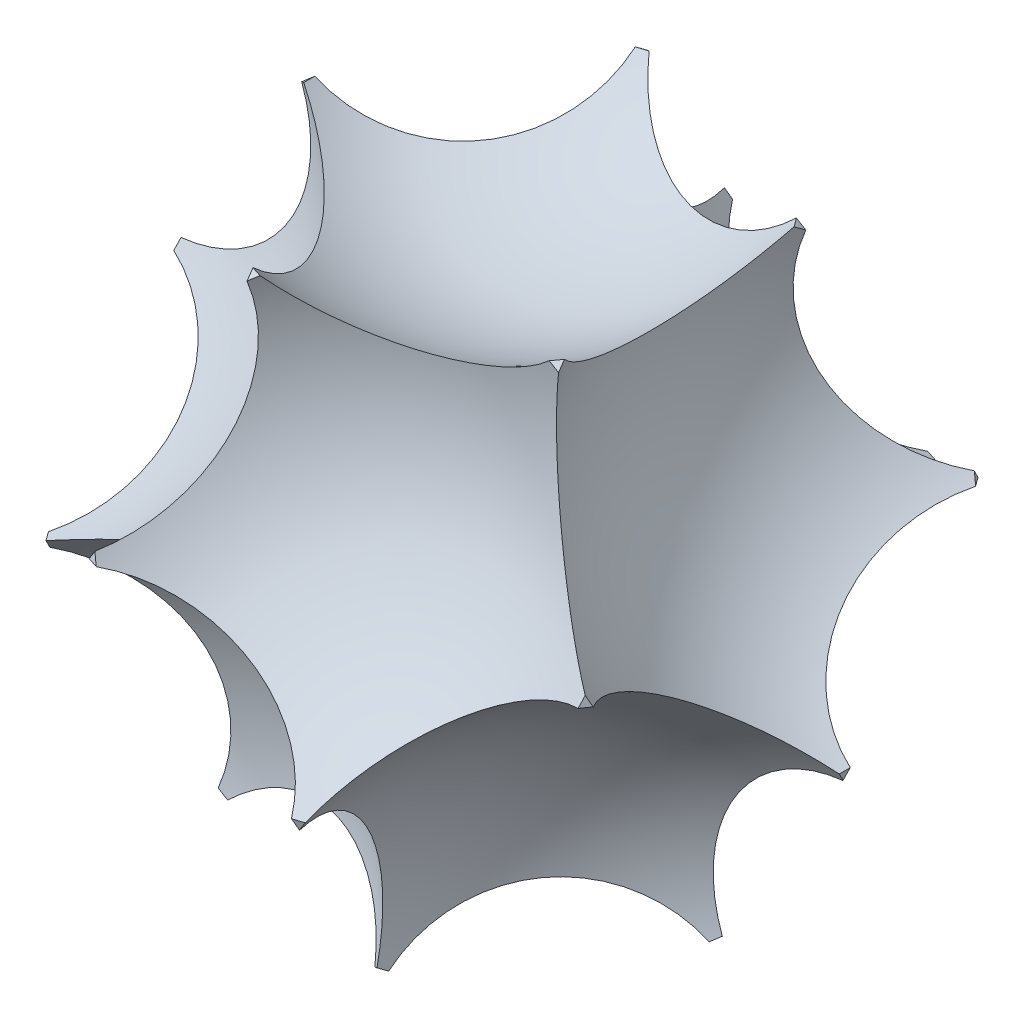
ISO-10303-21;
HEADER;
FILE_DESCRIPTION(('STEP AP214'),'2;1');
FILE_NAME('part.step','',(''),(''),'','','');
FILE_SCHEMA(('AUTOMOTIVE_DESIGN { 1 0 10303 214 1 1 1 1 }'));
ENDSEC;
DATA;
#1=APPLICATION_CONTEXT('core data for automotive mechanical design processes');
#2=APPLICATION_PROTOCOL_DEFINITION('international standard','automotive_design',2000,#1);
#3=PRODUCT_CONTEXT('',#1,'mechanical');
#4=PRODUCT('Part','Part','',(#3));
#5=PRODUCT_RELATED_PRODUCT_CATEGORY('part','',(#4));
#6=PRODUCT_DEFINITION_FORMATION('','',#4);
#7=PRODUCT_DEFINITION_CONTEXT('part definition',#1,'design');
#8=PRODUCT_DEFINITION('design','',#6,#7);
#9=PRODUCT_DEFINITION_SHAPE('','',#8);
#10=(LENGTH_UNIT() NAMED_UNIT(*) SI_UNIT(.MILLI.,.METRE.));
#11=(NAMED_UNIT(*) PLANE_ANGLE_UNIT() SI_UNIT($,.RADIAN.));
#12=(NAMED_UNIT(*) SI_UNIT($,.STERADIAN.) SOLID_ANGLE_UNIT());
#13=UNCERTAINTY_MEASURE_WITH_UNIT(LENGTH_MEASURE(1.E-05),#10,'distance_accuracy_value','');
#14=(GEOMETRIC_REPRESENTATION_CONTEXT(3) GLOBAL_UNCERTAINTY_ASSIGNED_CONTEXT((#13)) GLOBAL_UNIT_ASSIGNED_CONTEXT((#10,
#11,#12)) REPRESENTATION_CONTEXT('',''));
#15=CARTESIAN_POINT('',(0.,0.,0.));
#16=DIRECTION('',(0.,0.,1.));
#17=DIRECTION('',(1.,0.,0.));
#18=AXIS2_PLACEMENT_3D('',#15,#16,#17);
#19=CARTESIAN_POINT('',(0.,0.,0.));
#20=DIRECTION('',(0.,0.,1.));
#21=DIRECTION('',(-1.,0.,0.));
#22=AXIS2_PLACEMENT_3D('',#19,#20,#21);
#23=SPHERICAL_SURFACE('',#22,62.5);
#24=CARTESIAN_POINT('',(13.8234335866723,22.366785384462,-42.544153976935));
#25=DIRECTION('',(0.27639320225003,0.447213595499962,-0.850650808352035));
#26=DIRECTION('',(0.,0.885131422637845,0.465341127194992));
#27=AXIS2_PLACEMENT_3D('',#24,#25,#26);
#28=CIRCLE('',#27,37.4817896828196);
#29=CARTESIAN_POINT('',(29.7143347656824,50.0136525578055,-22.8460689673317));
#30=VERTEX_POINT('',#29);
#31=CARTESIAN_POINT('',(31.4449162804732,48.9440943613624,-22.8460689673317));
#32=VERTEX_POINT('',#31);
#33=EDGE_CURVE('E302',#30,#32,#28,.T.);
#34=ORIENTED_EDGE('',*,*,#33,.F.);
#35=CARTESIAN_POINT('',(0.,50.0136525578055,0.));
#36=DIRECTION('',(0.,1.,0.));
#37=DIRECTION('',(-1.,0.,0.));
#38=AXIS2_PLACEMENT_3D('',#35,#36,#37);
#39=CIRCLE('',#38,37.4817896828196);
#40=CARTESIAN_POINT('',(30.9101371822517,50.0136525578055,-21.2001881407099));
#41=VERTEX_POINT('',#40);
#42=EDGE_CURVE('E378',#41,#30,#39,.T.);
#43=ORIENTED_EDGE('',*,*,#42,.F.);
#44=CARTESIAN_POINT('',(44.7335707689236,22.366785384462,0.));
#45=DIRECTION('',(0.894427190999914,0.447213595499962,0.));
#46=DIRECTION('',(-0.447213595499962,0.894427190999914,0.));
#47=AXIS2_PLACEMENT_3D('',#44,#45,#46);
#48=CIRCLE('',#47,37.4817896828196);
#49=EDGE_CURVE('E357',#32,#41,#48,.T.);
#50=ORIENTED_EDGE('',*,*,#49,.F.);
#51=EDGE_LOOP('',(#34,#43,#50));
#52=FACE_BOUND('',#51,.T.);
#53=ADVANCED_FACE('F41',(#52),#23,.T.);
#54=CARTESIAN_POINT('',(49.478873459584,12.8761800031414,-35.9485058061831));
#55=VERTEX_POINT('',#54);
#56=CARTESIAN_POINT('',(49.1483618004099,11.1455984883499,-36.9657160984675));
#57=VERTEX_POINT('',#56);
#58=EDGE_CURVE('E250',#55,#57,#28,.T.);
#59=ORIENTED_EDGE('',*,*,#58,.F.);
#60=CARTESIAN_POINT('',(50.3441642169797,11.1455984883499,-35.3198352718451));
#61=VERTEX_POINT('',#60);
#62=EDGE_CURVE('E363',#61,#55,#48,.T.);
#63=ORIENTED_EDGE('',*,*,#62,.F.);
#64=CARTESIAN_POINT('',(36.1902189711337,-22.366785384462,-26.2937331803548));
#65=DIRECTION('',(0.72360679774998,-0.447213595499962,-0.525731112119128));
#66=DIRECTION('',(-0.587785252292469,0.,-0.809016994374951));
#67=AXIS2_PLACEMENT_3D('',#64,#65,#66);
#68=CIRCLE('',#67,37.4817896828196);
#69=EDGE_CURVE('E473',#57,#61,#68,.T.);
#70=ORIENTED_EDGE('',*,*,#69,.F.);
#71=EDGE_LOOP('',(#59,#63,#70));
#72=FACE_BOUND('',#71,.T.);
#73=ADVANCED_FACE('F520',(#72),#23,.T.);
#74=CARTESIAN_POINT('',(19.96880613295,-11.1455984883499,-58.1659042391774));
#75=VERTEX_POINT('',#74);
#76=CARTESIAN_POINT('',(18.03395717911,-11.1455984883499,-58.7945747735156));
#77=VERTEX_POINT('',#76);
#78=EDGE_CURVE('E310',#75,#77,#28,.T.);
#79=ORIENTED_EDGE('',*,*,#78,.F.);
#80=CARTESIAN_POINT('',(18.8992479365061,-12.8761800031421,-58.1659042391774));
#81=VERTEX_POINT('',#80);
#82=EDGE_CURVE('E336',#81,#75,#68,.T.);
#83=ORIENTED_EDGE('',*,*,#82,.F.);
#84=CARTESIAN_POINT('',(-13.8234335866717,-22.366785384462,-42.5441539769352));
#85=DIRECTION('',(-0.276393202250018,-0.447213595499962,-0.850650808352039));
#86=DIRECTION('',(0.,0.885131422637845,-0.46534112719499));
#87=AXIS2_PLACEMENT_3D('',#84,#85,#86);
#88=CIRCLE('',#87,37.4817896828196);
#89=EDGE_CURVE('E328',#77,#81,#88,.T.);
#90=ORIENTED_EDGE('',*,*,#89,.F.);
#91=EDGE_LOOP('',(#79,#83,#90));
#92=FACE_BOUND('',#91,.T.);
#93=ADVANCED_FACE('F334',(#92),#23,.T.);
#94=CARTESIAN_POINT('',(-18.0339571791091,11.1455984883499,-58.7945747735159));
#95=VERTEX_POINT('',#94);
#96=CARTESIAN_POINT('',(-18.8992479365053,12.8761800031421,-58.1659042391777));
#97=VERTEX_POINT('',#96);
#98=EDGE_CURVE('E57',#95,#97,#28,.T.);
#99=ORIENTED_EDGE('',*,*,#98,.F.);
#100=CARTESIAN_POINT('',(-19.9688061329491,11.1455984883499,-58.1659042391777));
#101=VERTEX_POINT('',#100);
#102=EDGE_CURVE('E331',#101,#95,#88,.T.);
#103=ORIENTED_EDGE('',*,*,#102,.F.);
#104=CARTESIAN_POINT('',(-36.1902189711333,22.366785384462,-26.2937331803553));
#105=DIRECTION('',(-0.723606797749973,0.447213595499962,-0.525731112119139));
#106=DIRECTION('',(-0.58778525229248,0.,0.809016994374942));
#107=AXIS2_PLACEMENT_3D('',#104,#105,#106);
#108=CIRCLE('',#107,37.4817896828196);
#109=EDGE_CURVE('E257',#97,#101,#108,.T.);
#110=ORIENTED_EDGE('',*,*,#109,.F.);
#111=EDGE_LOOP('',(#99,#103,#110));
#112=FACE_BOUND('',#111,.T.);
#113=ADVANCED_FACE('F540',(#112),#23,.T.);
#114=CARTESIAN_POINT('',(-13.8234335866723,-22.366785384462,42.544153976935));
#115=DIRECTION('',(-0.27639320225003,-0.447213595499962,0.850650808352035));
#116=DIRECTION('',(0.,-0.885131422637844,-0.465341127194992));
#117=AXIS2_PLACEMENT_3D('',#114,#115,#116);
#118=CIRCLE('',#117,37.4817896828196);
#119=CARTESIAN_POINT('',(10.6108193901283,-50.0136525578055,35.9485058061833));
#120=VERTEX_POINT('',#119);
#121=CARTESIAN_POINT('',(12.0108892457455,-48.9440943613622,36.9657160984677));
#122=VERTEX_POINT('',#121);
#123=EDGE_CURVE('E64',#120,#122,#118,.T.);
#124=ORIENTED_EDGE('',*,*,#123,.F.);
#125=CARTESIAN_POINT('',(0.,-50.0136525578055,0.));
#126=DIRECTION('',(0.,-1.,0.));
#127=DIRECTION('',(1.,0.,0.));
#128=AXIS2_PLACEMENT_3D('',#125,#126,#127);
#129=CIRCLE('',#128,37.4817896828196);
#130=CARTESIAN_POINT('',(12.5456683439672,-50.0136525578054,35.3198352718455));
#131=VERTEX_POINT('',#130);
#132=EDGE_CURVE('E429',#131,#120,#129,.T.);
#133=ORIENTED_EDGE('',*,*,#132,.F.);
#134=CARTESIAN_POINT('',(36.1902189711333,-22.366785384462,26.2937331803553));
#135=DIRECTION('',(0.723606797749973,-0.447213595499962,0.525731112119139));
#136=DIRECTION('',(0.58778525229248,0.,-0.809016994374942));
#137=AXIS2_PLACEMENT_3D('',#134,#135,#136);
#138=CIRCLE('',#137,37.4817896828196);
#139=EDGE_CURVE('E420',#122,#131,#138,.T.);
#140=ORIENTED_EDGE('',*,*,#139,.F.);
#141=EDGE_LOOP('',(#124,#133,#140));
#142=FACE_BOUND('',#141,.T.);
#143=ADVANCED_FACE('F427',(#142),#23,.T.);
#144=CARTESIAN_POINT('',(18.8992479365053,-12.8761800031422,58.1659042391777));
#145=VERTEX_POINT('',#144);
#146=CARTESIAN_POINT('',(18.0339571791091,-11.1455984883499,58.7945747735159));
#147=VERTEX_POINT('',#146);
#148=EDGE_CURVE('E286',#145,#147,#118,.T.);
#149=ORIENTED_EDGE('',*,*,#148,.F.);
#150=CARTESIAN_POINT('',(19.9688061329491,-11.1455984883499,58.1659042391777));
#151=VERTEX_POINT('',#150);
#152=EDGE_CURVE('E424',#151,#145,#138,.T.);
#153=ORIENTED_EDGE('',*,*,#152,.F.);
#154=CARTESIAN_POINT('',(13.8234335866717,22.366785384462,42.5441539769352));
#155=DIRECTION('',(0.276393202250018,0.447213595499962,0.850650808352039));
#156=DIRECTION('',(0.,-0.885131422637845,0.46534112719499));
#157=AXIS2_PLACEMENT_3D('',#154,#155,#156);
#158=CIRCLE('',#157,37.4817896828196);
#159=EDGE_CURVE('E489',#147,#151,#158,.T.);
#160=ORIENTED_EDGE('',*,*,#159,.F.);
#161=EDGE_LOOP('',(#149,#153,#160));
#162=FACE_BOUND('',#161,.T.);
#163=ADVANCED_FACE('F531',(#162),#23,.T.);
#164=CARTESIAN_POINT('',(-18.03395717911,11.1455984883499,58.7945747735156));
#165=VERTEX_POINT('',#164);
#166=CARTESIAN_POINT('',(-19.96880613295,11.1455984883499,58.1659042391774));
#167=VERTEX_POINT('',#166);
#168=EDGE_CURVE('E285',#165,#167,#118,.T.);
#169=ORIENTED_EDGE('',*,*,#168,.F.);
#170=CARTESIAN_POINT('',(-18.8992479365061,12.8761800031421,58.1659042391774));
#171=VERTEX_POINT('',#170);
#172=EDGE_CURVE('E488',#171,#165,#158,.T.);
#173=ORIENTED_EDGE('',*,*,#172,.F.);
#174=CARTESIAN_POINT('',(-36.1902189711337,22.366785384462,26.2937331803548));
#175=DIRECTION('',(-0.72360679774998,0.447213595499962,0.525731112119128));
#176=DIRECTION('',(0.587785252292469,0.,0.809016994374951));
#177=AXIS2_PLACEMENT_3D('',#174,#175,#176);
#178=CIRCLE('',#177,37.4817896828196);
#179=EDGE_CURVE('E455',#167,#171,#178,.T.);
#180=ORIENTED_EDGE('',*,*,#179,.F.);
#181=EDGE_LOOP('',(#169,#173,#180));
#182=FACE_BOUND('',#181,.T.);
#183=ADVANCED_FACE('F533',(#182),#23,.T.);
#184=CARTESIAN_POINT('',(-49.1483618004099,-11.1455984883499,36.9657160984675));
#185=VERTEX_POINT('',#184);
#186=CARTESIAN_POINT('',(-49.478873459584,-12.8761800031414,35.9485058061831));
#187=VERTEX_POINT('',#186);
#188=EDGE_CURVE('E279',#185,#187,#118,.T.);
#189=ORIENTED_EDGE('',*,*,#188,.F.);
#190=CARTESIAN_POINT('',(-50.3441642169797,-11.1455984883499,35.3198352718451));
#191=VERTEX_POINT('',#190);
#192=EDGE_CURVE('E456',#191,#185,#178,.T.);
#193=ORIENTED_EDGE('',*,*,#192,.F.);
#194=CARTESIAN_POINT('',(-44.7335707689236,-22.366785384462,0.));
#195=DIRECTION('',(-0.894427190999914,-0.447213595499962,0.));
#196=DIRECTION('',(0.447213595499962,-0.894427190999914,0.));
#197=AXIS2_PLACEMENT_3D('',#194,#195,#196);
#198=CIRCLE('',#197,37.4817896828196);
#199=EDGE_CURVE('E377',#187,#191,#198,.T.);
#200=ORIENTED_EDGE('',*,*,#199,.F.);
#201=EDGE_LOOP('',(#189,#193,#200));
#202=FACE_BOUND('',#201,.T.);
#203=ADVANCED_FACE('F538',(#202),#23,.T.);
#204=CARTESIAN_POINT('',(-38.868054069455,48.9440943613621,-2.7271463546641E-13));
#205=VERTEX_POINT('',#204);
#206=CARTESIAN_POINT('',(-37.4679842138377,50.0136525578054,-1.01721029228455));
#207=VERTEX_POINT('',#206);
#208=EDGE_CURVE('E269',#205,#207,#108,.T.);
#209=ORIENTED_EDGE('',*,*,#208,.F.);
#210=CARTESIAN_POINT('',(-37.4679842138377,50.0136525578055,1.01721029228402));
#211=VERTEX_POINT('',#210);
#212=EDGE_CURVE('E474',#211,#205,#178,.T.);
#213=ORIENTED_EDGE('',*,*,#212,.F.);
#214=EDGE_CURVE('E605',#207,#211,#39,.T.);
#215=ORIENTED_EDGE('',*,*,#214,.F.);
#216=EDGE_LOOP('',(#209,#213,#215));
#217=FACE_BOUND('',#216,.T.);
#218=ADVANCED_FACE('F639',(#217),#23,.T.);
#219=CARTESIAN_POINT('',(-12.0108892457455,48.9440943613622,-36.9657160984677));
#220=VERTEX_POINT('',#219);
#221=CARTESIAN_POINT('',(-10.6108193901283,50.0136525578054,-35.9485058061833));
#222=VERTEX_POINT('',#221);
#223=EDGE_CURVE('E237',#220,#222,#28,.T.);
#224=ORIENTED_EDGE('',*,*,#223,.F.);
#225=CARTESIAN_POINT('',(-12.5456683439672,50.0136525578055,-35.3198352718455));
#226=VERTEX_POINT('',#225);
#227=EDGE_CURVE('E246',#226,#220,#108,.T.);
#228=ORIENTED_EDGE('',*,*,#227,.F.);
#229=EDGE_CURVE('E247',#222,#226,#39,.T.);
#230=ORIENTED_EDGE('',*,*,#229,.F.);
#231=EDGE_LOOP('',(#224,#228,#230));
#232=FACE_BOUND('',#231,.T.);
#233=ADVANCED_FACE('F245',(#232),#23,.T.);
#234=CARTESIAN_POINT('',(-49.1483618004094,-11.1455984883499,-36.9657160984682));
#235=VERTEX_POINT('',#234);
#236=CARTESIAN_POINT('',(-50.3441642169797,-11.1455984883499,-35.319835271845));
#237=VERTEX_POINT('',#236);
#238=EDGE_CURVE('E259',#235,#237,#108,.T.);
#239=ORIENTED_EDGE('',*,*,#238,.F.);
#240=CARTESIAN_POINT('',(-49.4788734595836,-12.8761800031421,-35.9485058061833));
#241=VERTEX_POINT('',#240);
#242=EDGE_CURVE('E340',#241,#235,#88,.T.);
#243=ORIENTED_EDGE('',*,*,#242,.F.);
#244=EDGE_CURVE('E641',#237,#241,#198,.T.);
#245=ORIENTED_EDGE('',*,*,#244,.F.);
#246=EDGE_LOOP('',(#239,#243,#245));
#247=FACE_BOUND('',#246,.T.);
#248=ADVANCED_FACE('F630',(#247),#23,.T.);
#249=CARTESIAN_POINT('',(61.1592510461556,-12.8761800031422,4.32636567482151E-13));
#250=VERTEX_POINT('',#249);
#251=CARTESIAN_POINT('',(61.4897627053298,-11.1455984883499,1.01721029228535));
#252=VERTEX_POINT('',#251);
#253=EDGE_CURVE('E436',#250,#252,#138,.T.);
#254=ORIENTED_EDGE('',*,*,#253,.F.);
#255=CARTESIAN_POINT('',(61.4897627053298,-11.1455984883499,-1.01721029228443));
#256=VERTEX_POINT('',#255);
#257=EDGE_CURVE('E504',#256,#250,#68,.T.);
#258=ORIENTED_EDGE('',*,*,#257,.F.);
#259=EDGE_CURVE('E365',#252,#256,#48,.T.);
#260=ORIENTED_EDGE('',*,*,#259,.F.);
#261=EDGE_LOOP('',(#254,#258,#260));
#262=FACE_BOUND('',#261,.T.);
#263=ADVANCED_FACE('F628',(#262),#23,.T.);
#264=CARTESIAN_POINT('',(50.3441642169797,11.1455984883499,35.3198352718451));
#265=VERTEX_POINT('',#264);
#266=CARTESIAN_POINT('',(49.1483618004094,11.1455984883499,36.9657160984682));
#267=VERTEX_POINT('',#266);
#268=EDGE_CURVE('E433',#265,#267,#138,.T.);
#269=ORIENTED_EDGE('',*,*,#268,.F.);
#270=CARTESIAN_POINT('',(49.4788734595836,12.8761800031421,35.9485058061833));
#271=VERTEX_POINT('',#270);
#272=EDGE_CURVE('E371',#271,#265,#48,.T.);
#273=ORIENTED_EDGE('',*,*,#272,.F.);
#274=EDGE_CURVE('E500',#267,#271,#158,.T.);
#275=ORIENTED_EDGE('',*,*,#274,.F.);
#276=EDGE_LOOP('',(#269,#273,#275));
#277=FACE_BOUND('',#276,.T.);
#278=ADVANCED_FACE('F527',(#277),#23,.T.);
#279=CARTESIAN_POINT('',(-31.4449162804733,-48.9440943613624,22.8460689673317));
#280=VERTEX_POINT('',#279);
#281=CARTESIAN_POINT('',(-29.7143347656824,-50.0136525578054,22.8460689673317));
#282=VERTEX_POINT('',#281);
#283=EDGE_CURVE('E294',#280,#282,#118,.T.);
#284=ORIENTED_EDGE('',*,*,#283,.F.);
#285=CARTESIAN_POINT('',(-30.9101371822517,-50.0136525578054,21.20018814071));
#286=VERTEX_POINT('',#285);
#287=EDGE_CURVE('E372',#286,#280,#198,.T.);
#288=ORIENTED_EDGE('',*,*,#287,.F.);
#289=EDGE_CURVE('E376',#282,#286,#129,.T.);
#290=ORIENTED_EDGE('',*,*,#289,.F.);
#291=EDGE_LOOP('',(#284,#288,#290));
#292=FACE_BOUND('',#291,.T.);
#293=ADVANCED_FACE('F577',(#292),#23,.T.);
#294=CARTESIAN_POINT('',(-12.0108892457461,48.9440943613622,36.9657160984675));
#295=VERTEX_POINT('',#294);
#296=CARTESIAN_POINT('',(-12.5456683439677,50.0136525578054,35.3198352718453));
#297=VERTEX_POINT('',#296);
#298=EDGE_CURVE('E460',#295,#297,#178,.T.);
#299=ORIENTED_EDGE('',*,*,#298,.F.);
#300=CARTESIAN_POINT('',(-10.6108193901288,50.0136525578054,35.9485058061832));
#301=VERTEX_POINT('',#300);
#302=EDGE_CURVE('E484',#301,#295,#158,.T.);
#303=ORIENTED_EDGE('',*,*,#302,.F.);
#304=EDGE_CURVE('E603',#297,#301,#39,.T.);
#305=ORIENTED_EDGE('',*,*,#304,.F.);
#306=EDGE_LOOP('',(#299,#303,#305));
#307=FACE_BOUND('',#306,.T.);
#308=ADVANCED_FACE('F606',(#307),#23,.T.);
#309=CARTESIAN_POINT('',(-61.4897627053298,11.1455984883499,-1.01721029228534));
#310=VERTEX_POINT('',#309);
#311=CARTESIAN_POINT('',(-61.1592510461556,12.8761800031422,-4.32202886613157E-13));
#312=VERTEX_POINT('',#311);
#313=EDGE_CURVE('E265',#310,#312,#108,.T.);
#314=ORIENTED_EDGE('',*,*,#313,.F.);
#315=CARTESIAN_POINT('',(-61.4897627053298,11.1455984883499,1.01721029228444));
#316=VERTEX_POINT('',#315);
#317=EDGE_CURVE('E643',#316,#310,#198,.T.);
#318=ORIENTED_EDGE('',*,*,#317,.F.);
#319=EDGE_CURVE('E469',#312,#316,#178,.T.);
#320=ORIENTED_EDGE('',*,*,#319,.F.);
#321=EDGE_LOOP('',(#314,#318,#320));
#322=FACE_BOUND('',#321,.T.);
#323=ADVANCED_FACE('F620',(#322),#23,.T.);
#324=CARTESIAN_POINT('',(37.4679842138377,-50.0136525578055,1.01721029228457));
#325=VERTEX_POINT('',#324);
#326=CARTESIAN_POINT('',(38.868054069455,-48.9440943613622,2.7271463546641E-13));
#327=VERTEX_POINT('',#326);
#328=EDGE_CURVE('E263',#325,#327,#138,.T.);
#329=ORIENTED_EDGE('',*,*,#328,.F.);
#330=CARTESIAN_POINT('',(37.4679842138377,-50.0136525578055,-1.01721029228402));
#331=VERTEX_POINT('',#330);
#332=EDGE_CURVE('E562',#331,#325,#129,.T.);
#333=ORIENTED_EDGE('',*,*,#332,.F.);
#334=EDGE_CURVE('E483',#327,#331,#68,.T.);
#335=ORIENTED_EDGE('',*,*,#334,.F.);
#336=EDGE_LOOP('',(#329,#333,#335));
#337=FACE_BOUND('',#336,.T.);
#338=ADVANCED_FACE('F616',(#337),#23,.T.);
#339=CARTESIAN_POINT('',(31.4449162804734,48.9440943613622,22.8460689673321));
#340=VERTEX_POINT('',#339);
#341=CARTESIAN_POINT('',(29.7143347656821,50.0136525578055,22.8460689673321));
#342=VERTEX_POINT('',#341);
#343=EDGE_CURVE('E487',#340,#342,#158,.T.);
#344=ORIENTED_EDGE('',*,*,#343,.F.);
#345=CARTESIAN_POINT('',(30.9101371822517,50.0136525578055,21.2001881407099));
#346=VERTEX_POINT('',#345);
#347=EDGE_CURVE('E366',#346,#340,#48,.T.);
#348=ORIENTED_EDGE('',*,*,#347,.F.);
#349=EDGE_CURVE('E383',#342,#346,#39,.T.);
#350=ORIENTED_EDGE('',*,*,#349,.F.);
#351=EDGE_LOOP('',(#344,#348,#350));
#352=FACE_BOUND('',#351,.T.);
#353=ADVANCED_FACE('F555',(#352),#23,.T.);
#354=CARTESIAN_POINT('',(-29.7143347656821,-50.0136525578054,-22.8460689673321));
#355=VERTEX_POINT('',#354);
#356=CARTESIAN_POINT('',(-31.4449162804734,-48.9440943613622,-22.8460689673321));
#357=VERTEX_POINT('',#356);
#358=EDGE_CURVE('E344',#355,#357,#88,.T.);
#359=ORIENTED_EDGE('',*,*,#358,.F.);
#360=CARTESIAN_POINT('',(-30.9101371822517,-50.0136525578054,-21.20018814071));
#361=VERTEX_POINT('',#360);
#362=EDGE_CURVE('E384',#361,#355,#129,.T.);
#363=ORIENTED_EDGE('',*,*,#362,.F.);
#364=EDGE_CURVE('E370',#357,#361,#198,.T.);
#365=ORIENTED_EDGE('',*,*,#364,.F.);
#366=EDGE_LOOP('',(#359,#363,#365));
#367=FACE_BOUND('',#366,.T.);
#368=ADVANCED_FACE('F548',(#367),#23,.T.);
#369=CARTESIAN_POINT('',(12.5456683439677,-50.0136525578055,-35.3198352718453));
#370=VERTEX_POINT('',#369);
#371=CARTESIAN_POINT('',(12.0108892457461,-48.9440943613622,-36.9657160984675));
#372=VERTEX_POINT('',#371);
#373=EDGE_CURVE('E470',#370,#372,#68,.T.);
#374=ORIENTED_EDGE('',*,*,#373,.F.);
#375=CARTESIAN_POINT('',(10.6108193901288,-50.0136525578055,-35.9485058061832));
#376=VERTEX_POINT('',#375);
#377=EDGE_CURVE('E387',#376,#370,#129,.T.);
#378=ORIENTED_EDGE('',*,*,#377,.F.);
#379=EDGE_CURVE('E338',#372,#376,#88,.T.);
#380=ORIENTED_EDGE('',*,*,#379,.F.);
#381=EDGE_LOOP('',(#374,#378,#380));
#382=FACE_BOUND('',#381,.T.);
#383=ADVANCED_FACE('F43',(#382),#23,.T.);
#384=CARTESIAN_POINT('',(0.,88.5247215932137,0.));
#385=DIRECTION('',(0.,1.,0.));
#386=DIRECTION('',(-1.,0.,0.));
#387=AXIS2_PLACEMENT_3D('',#384,#385,#386);
#388=SPHERICAL_SURFACE('',#387,53.7399943810669);
#389=ORIENTED_EDGE('',*,*,#42,.T.);
#390=CARTESIAN_POINT('',(12.2338156397204,64.0570903137739,-37.651812991203));
#391=DIRECTION('',(0.262865556059576,-0.525731112119132,-0.809016994374946));
#392=DIRECTION('',(0.,0.838505147446964,-0.544893675596391));
#393=AXIS2_PLACEMENT_3D('',#390,#391,#392);
#394=CIRCLE('',#393,26.8699971905337);
#395=EDGE_CURVE('E315',#30,#222,#394,.T.);
#396=ORIENTED_EDGE('',*,*,#395,.T.);
#397=ORIENTED_EDGE('',*,*,#229,.T.);
#398=CARTESIAN_POINT('',(-32.0285451568866,64.0570903137739,-23.2701001666187));
#399=DIRECTION('',(-0.688190960235583,-0.525731112119132,-0.500000000000007));
#400=DIRECTION('',(0.607061998206687,-0.794654472291766,0.));
#401=AXIS2_PLACEMENT_3D('',#398,#399,#400);
#402=CIRCLE('',#401,26.8699971905337);
#403=EDGE_CURVE('E254',#226,#207,#402,.T.);
#404=ORIENTED_EDGE('',*,*,#403,.T.);
#405=ORIENTED_EDGE('',*,*,#214,.T.);
#406=CARTESIAN_POINT('',(-32.028545156887,64.0570903137739,23.2701001666182));
#407=DIRECTION('',(-0.68819096023559,-0.525731112119132,0.499999999999997));
#408=DIRECTION('',(0.607061998206683,-0.794654472291769,0.));
#409=AXIS2_PLACEMENT_3D('',#406,#407,#408);
#410=CIRCLE('',#409,26.8699971905337);
#411=EDGE_CURVE('E465',#211,#297,#410,.T.);
#412=ORIENTED_EDGE('',*,*,#411,.T.);
#413=ORIENTED_EDGE('',*,*,#304,.T.);
#414=CARTESIAN_POINT('',(12.2338156397198,64.0570903137739,37.6518129912032));
#415=DIRECTION('',(0.262865556059565,-0.525731112119132,0.809016994374949));
#416=DIRECTION('',(0.,-0.838505147446965,-0.544893675596389));
#417=AXIS2_PLACEMENT_3D('',#414,#415,#416);
#418=CIRCLE('',#417,26.8699971905337);
#419=EDGE_CURVE('E343',#301,#342,#418,.T.);
#420=ORIENTED_EDGE('',*,*,#419,.T.);
#421=ORIENTED_EDGE('',*,*,#349,.T.);
#422=CARTESIAN_POINT('',(39.5894590343338,64.0570903137739,0.));
#423=DIRECTION('',(0.850650808352041,-0.525731112119132,0.));
#424=DIRECTION('',(0.525731112119132,0.850650808352041,0.));
#425=AXIS2_PLACEMENT_3D('',#422,#423,#424);
#426=CIRCLE('',#425,26.8699971905337);
#427=EDGE_CURVE('E391',#346,#41,#426,.T.);
#428=ORIENTED_EDGE('',*,*,#427,.T.);
#429=EDGE_LOOP('',(#389,#396,#397,#404,#405,#412,#413,#420,#421,#428));
#430=FACE_BOUND('',#429,.T.);
#431=ADVANCED_FACE('F547',(#430),#388,.F.);
#432=CARTESIAN_POINT('',(0.,-88.5247215932137,0.));
#433=DIRECTION('',(0.,-1.,0.));
#434=DIRECTION('',(-1.,0.,0.));
#435=AXIS2_PLACEMENT_3D('',#432,#433,#434);
#436=SPHERICAL_SURFACE('',#435,53.7399943810669);
#437=ORIENTED_EDGE('',*,*,#132,.T.);
#438=CARTESIAN_POINT('',(-12.2338156397204,-64.057090313774,37.651812991203));
#439=DIRECTION('',(-0.262865556059576,0.525731112119131,0.809016994374946));
#440=DIRECTION('',(0.,-0.838505147446964,0.544893675596391));
#441=AXIS2_PLACEMENT_3D('',#438,#439,#440);
#442=CIRCLE('',#441,26.8699971905337);
#443=EDGE_CURVE('E570',#120,#282,#442,.T.);
#444=ORIENTED_EDGE('',*,*,#443,.T.);
#445=ORIENTED_EDGE('',*,*,#289,.T.);
#446=CARTESIAN_POINT('',(-39.5894590343338,-64.057090313774,0.));
#447=DIRECTION('',(-0.850650808352041,0.525731112119132,0.));
#448=DIRECTION('',(-0.525731112119132,-0.850650808352041,0.));
#449=AXIS2_PLACEMENT_3D('',#446,#447,#448);
#450=CIRCLE('',#449,26.8699971905337);
#451=EDGE_CURVE('E382',#286,#361,#450,.T.);
#452=ORIENTED_EDGE('',*,*,#451,.T.);
#453=ORIENTED_EDGE('',*,*,#362,.T.);
#454=CARTESIAN_POINT('',(-12.2338156397198,-64.0570903137739,-37.6518129912032));
#455=DIRECTION('',(-0.262865556059565,0.525731112119132,-0.809016994374949));
#456=DIRECTION('',(0.,0.838505147446965,0.544893675596389));
#457=AXIS2_PLACEMENT_3D('',#454,#455,#456);
#458=CIRCLE('',#457,26.8699971905337);
#459=EDGE_CURVE('E352',#355,#376,#458,.T.);
#460=ORIENTED_EDGE('',*,*,#459,.T.);
#461=ORIENTED_EDGE('',*,*,#377,.T.);
#462=CARTESIAN_POINT('',(32.0285451568869,-64.057090313774,-23.2701001666182));
#463=DIRECTION('',(0.688190960235591,0.525731112119131,-0.499999999999997));
#464=DIRECTION('',(-0.607061998206682,0.794654472291769,0.));
#465=AXIS2_PLACEMENT_3D('',#462,#463,#464);
#466=CIRCLE('',#465,26.8699971905337);
#467=EDGE_CURVE('E479',#370,#331,#466,.T.);
#468=ORIENTED_EDGE('',*,*,#467,.T.);
#469=ORIENTED_EDGE('',*,*,#332,.T.);
#470=CARTESIAN_POINT('',(32.0285451568866,-64.057090313774,23.2701001666187));
#471=DIRECTION('',(0.688190960235583,0.525731112119131,0.500000000000007));
#472=DIRECTION('',(-0.607061998206686,0.794654472291766,0.));
#473=AXIS2_PLACEMENT_3D('',#470,#471,#472);
#474=CIRCLE('',#473,26.8699971905337);
#475=EDGE_CURVE('E431',#325,#131,#474,.T.);
#476=ORIENTED_EDGE('',*,*,#475,.T.);
#477=EDGE_LOOP('',(#437,#444,#445,#452,#453,#460,#461,#468,#469,#476));
#478=FACE_BOUND('',#477,.T.);
#479=ADVANCED_FACE('F554',(#478),#436,.F.);
#480=CARTESIAN_POINT('',(-79.1789180686675,-39.5894590343342,0.));
#481=DIRECTION('',(-0.894427190999914,-0.447213595499962,0.));
#482=DIRECTION('',(0.447213595499962,-0.894427190999914,0.));
#483=AXIS2_PLACEMENT_3D('',#480,#481,#482);
#484=SPHERICAL_SURFACE('',#483,53.7399943810669);
#485=ORIENTED_EDGE('',*,*,#287,.T.);
#486=CARTESIAN_POINT('',(-51.8232746740541,-39.5894590343342,37.651812991203));
#487=DIRECTION('',(0.587785252292468,0.,0.809016994374951));
#488=DIRECTION('',(0.809016994374951,0.,-0.587785252292469));
#489=AXIS2_PLACEMENT_3D('',#486,#487,#488);
#490=CIRCLE('',#489,26.8699971905342);
#491=EDGE_CURVE('E283',#280,#187,#490,.T.);
#492=ORIENTED_EDGE('',*,*,#491,.T.);
#493=ORIENTED_EDGE('',*,*,#199,.T.);
#494=CARTESIAN_POINT('',(-71.6180041912207,0.,23.2701001666182));
#495=DIRECTION('',(0.162459848116449,0.850650808352045,0.499999999999993));
#496=DIRECTION('',(0.,-0.506731853971379,0.86210372239698));
#497=AXIS2_PLACEMENT_3D('',#494,#495,#496);
#498=CIRCLE('',#497,26.8699971905331);
#499=EDGE_CURVE('E461',#191,#316,#498,.T.);
#500=ORIENTED_EDGE('',*,*,#499,.T.);
#501=ORIENTED_EDGE('',*,*,#317,.T.);
#502=CARTESIAN_POINT('',(-71.6180041912204,0.,-23.2701001666187));
#503=DIRECTION('',(0.162459848116456,0.850650808352039,-0.5));
#504=DIRECTION('',(0.,0.506731853971387,0.862103722396975));
#505=AXIS2_PLACEMENT_3D('',#502,#503,#504);
#506=CIRCLE('',#505,26.8699971905326);
#507=EDGE_CURVE('E273',#310,#237,#506,.T.);
#508=ORIENTED_EDGE('',*,*,#507,.T.);
#509=ORIENTED_EDGE('',*,*,#244,.T.);
#510=CARTESIAN_POINT('',(-51.8232746740536,-39.5894590343342,-37.6518129912032));
#511=DIRECTION('',(0.587785252292474,0.,-0.809016994374947));
#512=DIRECTION('',(-0.809016994374947,0.,-0.587785252292474));
#513=AXIS2_PLACEMENT_3D('',#510,#511,#512);
#514=CIRCLE('',#513,26.8699971905334);
#515=EDGE_CURVE('E395',#241,#357,#514,.T.);
#516=ORIENTED_EDGE('',*,*,#515,.T.);
#517=ORIENTED_EDGE('',*,*,#364,.T.);
#518=ORIENTED_EDGE('',*,*,#451,.F.);
#519=EDGE_LOOP('',(#485,#492,#493,#500,#501,#508,#509,#516,#517,#518));
#520=FACE_BOUND('',#519,.T.);
#521=ADVANCED_FACE('F575',(#520),#484,.F.);
#522=CARTESIAN_POINT('',(79.1789180686675,39.5894590343342,0.));
#523=DIRECTION('',(0.894427190999914,0.447213595499962,0.));
#524=DIRECTION('',(0.447213595499962,-0.894427190999914,0.));
#525=AXIS2_PLACEMENT_3D('',#522,#523,#524);
#526=SPHERICAL_SURFACE('',#525,53.7399943810669);
#527=ORIENTED_EDGE('',*,*,#62,.T.);
#528=CARTESIAN_POINT('',(51.8232746740541,39.5894590343342,-37.651812991203));
#529=DIRECTION('',(-0.587785252292468,0.,-0.809016994374951));
#530=DIRECTION('',(-0.809016994374951,0.,0.587785252292469));
#531=AXIS2_PLACEMENT_3D('',#528,#529,#530);
#532=CIRCLE('',#531,26.8699971905342);
#533=EDGE_CURVE('E301',#55,#32,#532,.T.);
#534=ORIENTED_EDGE('',*,*,#533,.T.);
#535=ORIENTED_EDGE('',*,*,#49,.T.);
#536=ORIENTED_EDGE('',*,*,#427,.F.);
#537=ORIENTED_EDGE('',*,*,#347,.T.);
#538=CARTESIAN_POINT('',(51.8232746740536,39.5894590343342,37.6518129912032));
#539=DIRECTION('',(-0.587785252292474,0.,0.809016994374947));
#540=DIRECTION('',(0.809016994374947,0.,0.587785252292474));
#541=AXIS2_PLACEMENT_3D('',#538,#539,#540);
#542=CIRCLE('',#541,26.8699971905334);
#543=EDGE_CURVE('E398',#340,#271,#542,.T.);
#544=ORIENTED_EDGE('',*,*,#543,.T.);
#545=ORIENTED_EDGE('',*,*,#272,.T.);
#546=CARTESIAN_POINT('',(71.6180041912204,0.,23.2701001666187));
#547=DIRECTION('',(-0.162459848116456,-0.850650808352039,0.5));
#548=DIRECTION('',(0.,-0.506731853971387,-0.862103722396975));
#549=AXIS2_PLACEMENT_3D('',#546,#547,#548);
#550=CIRCLE('',#549,26.8699971905326);
#551=EDGE_CURVE('E437',#265,#252,#550,.T.);
#552=ORIENTED_EDGE('',*,*,#551,.T.);
#553=ORIENTED_EDGE('',*,*,#259,.T.);
#554=CARTESIAN_POINT('',(71.6180041912207,0.,-23.2701001666182));
#555=DIRECTION('',(-0.162459848116449,-0.850650808352045,-0.499999999999993));
#556=DIRECTION('',(0.,0.506731853971379,-0.86210372239698));
#557=AXIS2_PLACEMENT_3D('',#554,#555,#556);
#558=CIRCLE('',#557,26.8699971905331);
#559=EDGE_CURVE('E475',#256,#61,#558,.T.);
#560=ORIENTED_EDGE('',*,*,#559,.T.);
#561=EDGE_LOOP('',(#527,#534,#535,#536,#537,#544,#545,#552,#553,#560));
#562=FACE_BOUND('',#561,.T.);
#563=ADVANCED_FACE('F519',(#562),#526,.F.);
#564=CARTESIAN_POINT('',(-24.4676312794396,-39.5894590343342,-75.3036259824064));
#565=DIRECTION('',(-0.276393202250018,-0.447213595499962,-0.850650808352039));
#566=DIRECTION('',(0.138196601125011,-0.894427190999914,0.425325404176024));
#567=AXIS2_PLACEMENT_3D('',#564,#565,#566);
#568=SPHERICAL_SURFACE('',#567,53.7399943810669);
#569=ORIENTED_EDGE('',*,*,#102,.T.);
#570=CARTESIAN_POINT('',(5.34294830600857E-13,0.,-75.3036259824062));
#571=DIRECTION('',(0.525731112119134,0.850650808352039,0.));
#572=DIRECTION('',(-0.850650808352039,0.525731112119134,0.));
#573=AXIS2_PLACEMENT_3D('',#570,#571,#572);
#574=CIRCLE('',#573,26.8699971905326);
#575=EDGE_CURVE('E319',#95,#77,#574,.T.);
#576=ORIENTED_EDGE('',*,*,#575,.T.);
#577=ORIENTED_EDGE('',*,*,#89,.T.);
#578=CARTESIAN_POINT('',(19.7947295171671,-39.5894590343342,-60.9219131578214));
#579=DIRECTION('',(0.951056516295152,0.,0.309016994374951));
#580=DIRECTION('',(0.309016994374951,0.,-0.951056516295152));
#581=AXIS2_PLACEMENT_3D('',#578,#579,#580);
#582=CIRCLE('',#581,26.8699971905334);
#583=EDGE_CURVE('E402',#81,#372,#582,.T.);
#584=ORIENTED_EDGE('',*,*,#583,.T.);
#585=ORIENTED_EDGE('',*,*,#379,.T.);
#586=ORIENTED_EDGE('',*,*,#459,.F.);
#587=ORIENTED_EDGE('',*,*,#358,.T.);
#588=ORIENTED_EDGE('',*,*,#515,.F.);
#589=ORIENTED_EDGE('',*,*,#242,.T.);
#590=CARTESIAN_POINT('',(-44.2623607966064,0.,-60.9219131578219));
#591=DIRECTION('',(-0.425325404176016,0.850650808352045,0.30901699437494));
#592=DIRECTION('',(-0.894427190999919,-0.447213595499952,0.));
#593=AXIS2_PLACEMENT_3D('',#590,#591,#592);
#594=CIRCLE('',#593,26.8699971905331);
#595=EDGE_CURVE('E256',#235,#101,#594,.T.);
#596=ORIENTED_EDGE('',*,*,#595,.T.);
#597=EDGE_LOOP('',(#569,#576,#577,#584,#585,#586,#587,#588,#589,#596));
#598=FACE_BOUND('',#597,.T.);
#599=ADVANCED_FACE('F326',(#598),#568,.F.);
#600=CARTESIAN_POINT('',(24.4676312794396,39.5894590343342,75.3036259824064));
#601=DIRECTION('',(0.276393202250018,0.447213595499962,0.850650808352039));
#602=DIRECTION('',(0.13819660112501,-0.894427190999914,0.425325404176024));
#603=AXIS2_PLACEMENT_3D('',#600,#601,#602);
#604=SPHERICAL_SURFACE('',#603,53.7399943810669);
#605=ORIENTED_EDGE('',*,*,#172,.T.);
#606=CARTESIAN_POINT('',(-5.34294830600857E-13,0.,75.3036259824062));
#607=DIRECTION('',(-0.525731112119134,-0.850650808352039,0.));
#608=DIRECTION('',(0.850650808352039,-0.525731112119134,0.));
#609=AXIS2_PLACEMENT_3D('',#606,#607,#608);
#610=CIRCLE('',#609,26.8699971905326);
#611=EDGE_CURVE('E300',#165,#147,#610,.T.);
#612=ORIENTED_EDGE('',*,*,#611,.T.);
#613=ORIENTED_EDGE('',*,*,#159,.T.);
#614=CARTESIAN_POINT('',(44.2623607966064,0.,60.9219131578219));
#615=DIRECTION('',(0.425325404176016,-0.850650808352045,-0.30901699437494));
#616=DIRECTION('',(0.894427190999919,0.447213595499952,0.));
#617=AXIS2_PLACEMENT_3D('',#614,#615,#616);
#618=CIRCLE('',#617,26.8699971905331);
#619=EDGE_CURVE('E441',#151,#267,#618,.T.);
#620=ORIENTED_EDGE('',*,*,#619,.T.);
#621=ORIENTED_EDGE('',*,*,#274,.T.);
#622=ORIENTED_EDGE('',*,*,#543,.F.);
#623=ORIENTED_EDGE('',*,*,#343,.T.);
#624=ORIENTED_EDGE('',*,*,#419,.F.);
#625=ORIENTED_EDGE('',*,*,#302,.T.);
#626=CARTESIAN_POINT('',(-19.7947295171671,39.5894590343342,60.9219131578214));
#627=DIRECTION('',(-0.951056516295152,0.,-0.309016994374951));
#628=DIRECTION('',(-0.309016994374951,0.,0.951056516295152));
#629=AXIS2_PLACEMENT_3D('',#626,#627,#628);
#630=CIRCLE('',#629,26.8699971905334);
#631=EDGE_CURVE('E405',#295,#171,#630,.T.);
#632=ORIENTED_EDGE('',*,*,#631,.T.);
#633=EDGE_LOOP('',(#605,#612,#613,#620,#621,#622,#623,#624,#625,#632));
#634=FACE_BOUND('',#633,.T.);
#635=ADVANCED_FACE('F528',(#634),#604,.F.);
#636=CARTESIAN_POINT('',(64.0570903137739,-39.5894590343342,-46.5402003332364));
#637=DIRECTION('',(0.72360679774998,-0.447213595499962,-0.525731112119128));
#638=DIRECTION('',(-0.361803398874994,-0.894427190999914,0.262865556059567));
#639=AXIS2_PLACEMENT_3D('',#636,#637,#638);
#640=SPHERICAL_SURFACE('',#639,53.7399943810669);
#641=ORIENTED_EDGE('',*,*,#82,.T.);
#642=CARTESIAN_POINT('',(44.2623607966073,0.,-60.9219131578213));
#643=DIRECTION('',(-0.425325404176011,0.850650808352045,-0.309016994374947));
#644=DIRECTION('',(-0.894427190999921,-0.447213595499949,0.));
#645=AXIS2_PLACEMENT_3D('',#642,#643,#644);
#646=CIRCLE('',#645,26.8699971905331);
#647=EDGE_CURVE('E307',#75,#57,#646,.T.);
#648=ORIENTED_EDGE('',*,*,#647,.T.);
#649=ORIENTED_EDGE('',*,*,#69,.T.);
#650=ORIENTED_EDGE('',*,*,#559,.F.);
#651=ORIENTED_EDGE('',*,*,#257,.T.);
#652=CARTESIAN_POINT('',(64.0570903137736,-39.5894590343342,4.57966997657877E-13));
#653=DIRECTION('',(0.,0.,1.));
#654=DIRECTION('',(1.,0.,0.));
#655=AXIS2_PLACEMENT_3D('',#652,#653,#654);
#656=CIRCLE('',#655,26.8699971905334);
#657=EDGE_CURVE('E409',#250,#327,#656,.T.);
#658=ORIENTED_EDGE('',*,*,#657,.T.);
#659=ORIENTED_EDGE('',*,*,#334,.T.);
#660=ORIENTED_EDGE('',*,*,#467,.F.);
#661=ORIENTED_EDGE('',*,*,#373,.T.);
#662=ORIENTED_EDGE('',*,*,#583,.F.);
#663=EDGE_LOOP('',(#641,#648,#649,#650,#651,#658,#659,#660,#661,#662));
#664=FACE_BOUND('',#663,.T.);
#665=ADVANCED_FACE('F515',(#664),#640,.F.);
#666=CARTESIAN_POINT('',(-64.0570903137739,39.5894590343342,46.5402003332364));
#667=DIRECTION('',(-0.723606797749981,0.447213595499962,0.525731112119129));
#668=DIRECTION('',(-0.361803398874994,-0.894427190999914,0.262865556059567));
#669=AXIS2_PLACEMENT_3D('',#666,#667,#668);
#670=SPHERICAL_SURFACE('',#669,53.7399943810669);
#671=ORIENTED_EDGE('',*,*,#192,.T.);
#672=CARTESIAN_POINT('',(-44.2623607966073,0.,60.9219131578213));
#673=DIRECTION('',(0.425325404176011,-0.850650808352045,0.309016994374947));
#674=DIRECTION('',(0.894427190999921,0.447213595499949,0.));
#675=AXIS2_PLACEMENT_3D('',#672,#673,#674);
#676=CIRCLE('',#675,26.8699971905331);
#677=EDGE_CURVE('E290',#185,#167,#676,.T.);
#678=ORIENTED_EDGE('',*,*,#677,.T.);
#679=ORIENTED_EDGE('',*,*,#179,.T.);
#680=ORIENTED_EDGE('',*,*,#631,.F.);
#681=ORIENTED_EDGE('',*,*,#298,.T.);
#682=ORIENTED_EDGE('',*,*,#411,.F.);
#683=ORIENTED_EDGE('',*,*,#212,.T.);
#684=CARTESIAN_POINT('',(-64.0570903137736,39.5894590343342,-4.57966997657877E-13));
#685=DIRECTION('',(0.,0.,-1.));
#686=DIRECTION('',(-1.,0.,0.));
#687=AXIS2_PLACEMENT_3D('',#684,#685,#686);
#688=CIRCLE('',#687,26.8699971905334);
#689=EDGE_CURVE('E413',#205,#312,#688,.T.);
#690=ORIENTED_EDGE('',*,*,#689,.T.);
#691=ORIENTED_EDGE('',*,*,#319,.T.);
#692=ORIENTED_EDGE('',*,*,#499,.F.);
#693=EDGE_LOOP('',(#671,#678,#679,#680,#681,#682,#683,#690,#691,#692));
#694=FACE_BOUND('',#693,.T.);
#695=ADVANCED_FACE('F587',(#694),#670,.F.);
#696=CARTESIAN_POINT('',(64.0570903137732,-39.5894590343342,46.5402003332374));
#697=DIRECTION('',(0.723606797749973,-0.447213595499962,0.525731112119139));
#698=DIRECTION('',(-0.361803398874991,-0.894427190999914,-0.262865556059573));
#699=AXIS2_PLACEMENT_3D('',#696,#697,#698);
#700=SPHERICAL_SURFACE('',#699,53.7399943810669);
#701=ORIENTED_EDGE('',*,*,#152,.T.);
#702=CARTESIAN_POINT('',(19.7947295171662,-39.5894590343342,60.9219131578217));
#703=DIRECTION('',(-0.951056516295157,0.,0.309016994374938));
#704=DIRECTION('',(0.309016994374938,0.,0.951056516295157));
#705=AXIS2_PLACEMENT_3D('',#702,#703,#704);
#706=CIRCLE('',#705,26.8699971905334);
#707=EDGE_CURVE('E50',#145,#122,#706,.T.);
#708=ORIENTED_EDGE('',*,*,#707,.T.);
#709=ORIENTED_EDGE('',*,*,#139,.T.);
#710=ORIENTED_EDGE('',*,*,#475,.F.);
#711=ORIENTED_EDGE('',*,*,#328,.T.);
#712=ORIENTED_EDGE('',*,*,#657,.F.);
#713=ORIENTED_EDGE('',*,*,#253,.T.);
#714=ORIENTED_EDGE('',*,*,#551,.F.);
#715=ORIENTED_EDGE('',*,*,#268,.T.);
#716=ORIENTED_EDGE('',*,*,#619,.F.);
#717=EDGE_LOOP('',(#701,#708,#709,#710,#711,#712,#713,#714,#715,#716));
#718=FACE_BOUND('',#717,.T.);
#719=ADVANCED_FACE('F419',(#718),#700,.F.);
#720=CARTESIAN_POINT('',(-64.0570903137732,39.5894590343342,-46.5402003332374));
#721=DIRECTION('',(-0.723606797749973,0.447213595499962,-0.525731112119139));
#722=DIRECTION('',(-0.36180339887499,-0.894427190999914,-0.262865556059572));
#723=AXIS2_PLACEMENT_3D('',#720,#721,#722);
#724=SPHERICAL_SURFACE('',#723,53.7399943810669);
#725=ORIENTED_EDGE('',*,*,#227,.T.);
#726=CARTESIAN_POINT('',(-19.7947295171662,39.5894590343342,-60.9219131578217));
#727=DIRECTION('',(0.951056516295157,0.,-0.309016994374938));
#728=DIRECTION('',(-0.309016994374938,0.,-0.951056516295157));
#729=AXIS2_PLACEMENT_3D('',#726,#727,#728);
#730=CIRCLE('',#729,26.8699971905334);
#731=EDGE_CURVE('E11',#220,#97,#730,.T.);
#732=ORIENTED_EDGE('',*,*,#731,.T.);
#733=ORIENTED_EDGE('',*,*,#109,.T.);
#734=ORIENTED_EDGE('',*,*,#595,.F.);
#735=ORIENTED_EDGE('',*,*,#238,.T.);
#736=ORIENTED_EDGE('',*,*,#507,.F.);
#737=ORIENTED_EDGE('',*,*,#313,.T.);
#738=ORIENTED_EDGE('',*,*,#689,.F.);
#739=ORIENTED_EDGE('',*,*,#208,.T.);
#740=ORIENTED_EDGE('',*,*,#403,.F.);
#741=EDGE_LOOP('',(#725,#732,#733,#734,#735,#736,#737,#738,#739,#740));
#742=FACE_BOUND('',#741,.T.);
#743=ADVANCED_FACE('F252',(#742),#724,.F.);
#744=CARTESIAN_POINT('',(-24.4676312794407,-39.5894590343342,75.3036259824061));
#745=DIRECTION('',(-0.27639320225003,-0.447213595499962,0.850650808352035));
#746=DIRECTION('',(0.138196601125017,-0.894427190999914,-0.425325404176023));
#747=AXIS2_PLACEMENT_3D('',#744,#745,#746);
#748=SPHERICAL_SURFACE('',#747,53.7399943810669);
#749=ORIENTED_EDGE('',*,*,#188,.T.);
#750=ORIENTED_EDGE('',*,*,#491,.F.);
#751=ORIENTED_EDGE('',*,*,#283,.T.);
#752=ORIENTED_EDGE('',*,*,#443,.F.);
#753=ORIENTED_EDGE('',*,*,#123,.T.);
#754=ORIENTED_EDGE('',*,*,#707,.F.);
#755=ORIENTED_EDGE('',*,*,#148,.T.);
#756=ORIENTED_EDGE('',*,*,#611,.F.);
#757=ORIENTED_EDGE('',*,*,#168,.T.);
#758=ORIENTED_EDGE('',*,*,#677,.F.);
#759=EDGE_LOOP('',(#749,#750,#751,#752,#753,#754,#755,#756,#757,#758));
#760=FACE_BOUND('',#759,.T.);
#761=ADVANCED_FACE('F793',(#760),#748,.F.);
#762=CARTESIAN_POINT('',(24.4676312794407,39.5894590343342,-75.3036259824061));
#763=DIRECTION('',(0.27639320225003,0.447213595499962,-0.850650808352035));
#764=DIRECTION('',(0.138196601125016,-0.894427190999914,-0.425325404176022));
#765=AXIS2_PLACEMENT_3D('',#762,#763,#764);
#766=SPHERICAL_SURFACE('',#765,53.7399943810669);
#767=ORIENTED_EDGE('',*,*,#58,.T.);
#768=ORIENTED_EDGE('',*,*,#647,.F.);
#769=ORIENTED_EDGE('',*,*,#78,.T.);
#770=ORIENTED_EDGE('',*,*,#575,.F.);
#771=ORIENTED_EDGE('',*,*,#98,.T.);
#772=ORIENTED_EDGE('',*,*,#731,.F.);
#773=ORIENTED_EDGE('',*,*,#223,.T.);
#774=ORIENTED_EDGE('',*,*,#395,.F.);
#775=ORIENTED_EDGE('',*,*,#33,.T.);
#776=ORIENTED_EDGE('',*,*,#533,.F.);
#777=EDGE_LOOP('',(#767,#768,#769,#770,#771,#772,#773,#774,#775,#776));
#778=FACE_BOUND('',#777,.T.);
#779=ADVANCED_FACE('F236',(#778),#766,.F.);
#780=CLOSED_SHELL('',(#53,#73,#93,#113,#143,#163,#183,#203,#218,#233,#248,#263,#278,#293,#308,
#323,#338,#353,#368,#383,#431,#479,#521,#563,#599,#635,#665,#695,#719,#743,#761,#779));
#781=MANIFOLD_SOLID_BREP('B2',#780);
#782=ADVANCED_BREP_SHAPE_REPRESENTATION('',(#18,#781),#14);
#783=SHAPE_DEFINITION_REPRESENTATION(#9,#782);
ENDSEC;
END-ISO-10303-21;
